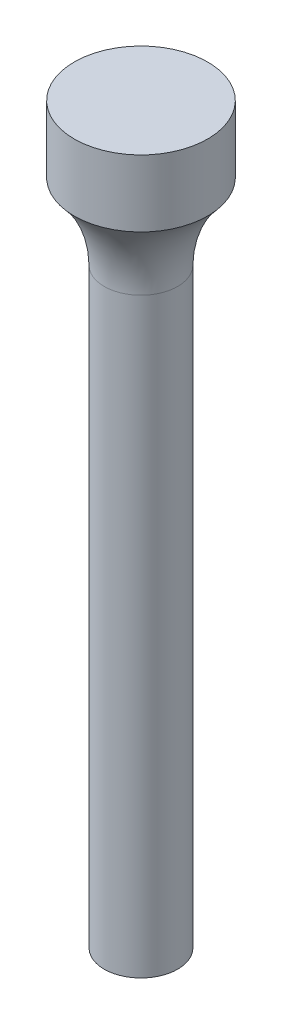
ISO-10303-21;
HEADER;
FILE_DESCRIPTION(('STEP AP214'),'2;1');
FILE_NAME('part.step','',(''),(''),'','','');
FILE_SCHEMA(('AUTOMOTIVE_DESIGN { 1 0 10303 214 1 1 1 1 }'));
ENDSEC;
DATA;
#1=APPLICATION_CONTEXT('core data for automotive mechanical design processes');
#2=APPLICATION_PROTOCOL_DEFINITION('international standard','automotive_design',2000,#1);
#3=PRODUCT_CONTEXT('',#1,'mechanical');
#4=PRODUCT('Part','Part','',(#3));
#5=PRODUCT_RELATED_PRODUCT_CATEGORY('part','',(#4));
#6=PRODUCT_DEFINITION_FORMATION('','',#4);
#7=PRODUCT_DEFINITION_CONTEXT('part definition',#1,'design');
#8=PRODUCT_DEFINITION('design','',#6,#7);
#9=PRODUCT_DEFINITION_SHAPE('','',#8);
#10=(LENGTH_UNIT() NAMED_UNIT(*) SI_UNIT(.MILLI.,.METRE.));
#11=(NAMED_UNIT(*) PLANE_ANGLE_UNIT() SI_UNIT($,.RADIAN.));
#12=(NAMED_UNIT(*) SI_UNIT($,.STERADIAN.) SOLID_ANGLE_UNIT());
#13=UNCERTAINTY_MEASURE_WITH_UNIT(LENGTH_MEASURE(1.E-05),#10,'distance_accuracy_value','');
#14=(GEOMETRIC_REPRESENTATION_CONTEXT(3) GLOBAL_UNCERTAINTY_ASSIGNED_CONTEXT((#13)) GLOBAL_UNIT_ASSIGNED_CONTEXT((#10,
#11,#12)) REPRESENTATION_CONTEXT('',''));
#15=CARTESIAN_POINT('',(0.,0.,0.));
#16=DIRECTION('',(0.,0.,1.));
#17=DIRECTION('',(1.,0.,0.));
#18=AXIS2_PLACEMENT_3D('',#15,#16,#17);
#19=CARTESIAN_POINT('',(0.,30.,0.));
#20=DIRECTION('',(0.,-1.,0.));
#21=DIRECTION('',(0.,0.,-1.));
#22=AXIS2_PLACEMENT_3D('',#19,#20,#21);
#23=CYLINDRICAL_SURFACE('',#22,1.65);
#24=CARTESIAN_POINT('',(0.,26.5827642750316,0.));
#25=DIRECTION('',(0.,1.,0.));
#26=DIRECTION('',(0.,0.,1.));
#27=AXIS2_PLACEMENT_3D('',#24,#25,#26);
#28=CIRCLE('',#27,1.65);
#29=CARTESIAN_POINT('',(0.,26.5827642750316,1.65));
#30=VERTEX_POINT('',#29);
#31=EDGE_CURVE('E10',#30,#30,#28,.F.);
#32=ORIENTED_EDGE('',*,*,#31,.T.);
#33=EDGE_LOOP('',(#32));
#34=FACE_BOUND('',#33,.T.);
#35=CARTESIAN_POINT('',(0.,0.,0.));
#36=DIRECTION('',(0.,1.,0.));
#37=DIRECTION('',(0.,0.,1.));
#38=AXIS2_PLACEMENT_3D('',#35,#36,#37);
#39=CIRCLE('',#38,1.65);
#40=CARTESIAN_POINT('',(0.,0.,1.65));
#41=VERTEX_POINT('',#40);
#42=EDGE_CURVE('E38',#41,#41,#39,.T.);
#43=ORIENTED_EDGE('',*,*,#42,.T.);
#44=EDGE_LOOP('',(#43));
#45=FACE_BOUND('',#44,.T.);
#46=ADVANCED_FACE('F31',(#34,#45),#23,.T.);
#47=CARTESIAN_POINT('',(0.,0.,0.));
#48=DIRECTION('',(0.,1.,0.));
#49=DIRECTION('',(0.,0.,1.));
#50=AXIS2_PLACEMENT_3D('',#47,#48,#49);
#51=PLANE('',#50);
#52=ORIENTED_EDGE('',*,*,#42,.F.);
#53=EDGE_LOOP('',(#52));
#54=FACE_BOUND('',#53,.T.);
#55=ADVANCED_FACE('F63',(#54),#51,.F.);
#56=CARTESIAN_POINT('',(0.,33.,0.));
#57=DIRECTION('',(0.,-1.,0.));
#58=DIRECTION('',(0.,0.,-1.));
#59=AXIS2_PLACEMENT_3D('',#56,#57,#58);
#60=CYLINDRICAL_SURFACE('',#59,3.);
#61=CARTESIAN_POINT('',(0.,33.,0.));
#62=DIRECTION('',(0.,1.,0.));
#63=DIRECTION('',(0.,0.,1.));
#64=AXIS2_PLACEMENT_3D('',#61,#62,#63);
#65=CIRCLE('',#64,3.);
#66=CARTESIAN_POINT('',(0.,33.,3.));
#67=VERTEX_POINT('',#66);
#68=EDGE_CURVE('E42',#67,#67,#65,.T.);
#69=ORIENTED_EDGE('',*,*,#68,.F.);
#70=EDGE_LOOP('',(#69));
#71=FACE_BOUND('',#70,.T.);
#72=CARTESIAN_POINT('',(0.,30.,0.));
#73=DIRECTION('',(0.,1.,0.));
#74=DIRECTION('',(0.,0.,1.));
#75=AXIS2_PLACEMENT_3D('',#72,#73,#74);
#76=CIRCLE('',#75,3.);
#77=CARTESIAN_POINT('',(0.,30.,3.));
#78=VERTEX_POINT('',#77);
#79=EDGE_CURVE('E46',#78,#78,#76,.T.);
#80=ORIENTED_EDGE('',*,*,#79,.T.);
#81=EDGE_LOOP('',(#80));
#82=FACE_BOUND('',#81,.T.);
#83=ADVANCED_FACE('F52',(#71,#82),#60,.T.);
#84=CARTESIAN_POINT('',(0.,33.,0.));
#85=DIRECTION('',(0.,1.,0.));
#86=DIRECTION('',(0.,0.,1.));
#87=AXIS2_PLACEMENT_3D('',#84,#85,#86);
#88=PLANE('',#87);
#89=ORIENTED_EDGE('',*,*,#68,.T.);
#90=EDGE_LOOP('',(#89));
#91=FACE_BOUND('',#90,.T.);
#92=ADVANCED_FACE('F55',(#91),#88,.T.);
#93=CARTESIAN_POINT('',(0.,26.5827642750316,0.));
#94=DIRECTION('',(0.,1.,0.));
#95=DIRECTION('',(0.,0.,1.));
#96=AXIS2_PLACEMENT_3D('',#93,#94,#95);
#97=TOROIDAL_SURFACE('',#96,6.65,5.);
#98=ORIENTED_EDGE('',*,*,#31,.F.);
#99=EDGE_LOOP('',(#98));
#100=FACE_BOUND('',#99,.T.);
#101=ORIENTED_EDGE('',*,*,#79,.F.);
#102=EDGE_LOOP('',(#101));
#103=FACE_BOUND('',#102,.T.);
#104=ADVANCED_FACE('F33',(#100,#103),#97,.F.);
#105=CLOSED_SHELL('',(#46,#55,#83,#92,#104));
#106=MANIFOLD_SOLID_BREP('B2',#105);
#107=ADVANCED_BREP_SHAPE_REPRESENTATION('',(#18,#106),#14);
#108=SHAPE_DEFINITION_REPRESENTATION(#9,#107);
ENDSEC;
END-ISO-10303-21;
